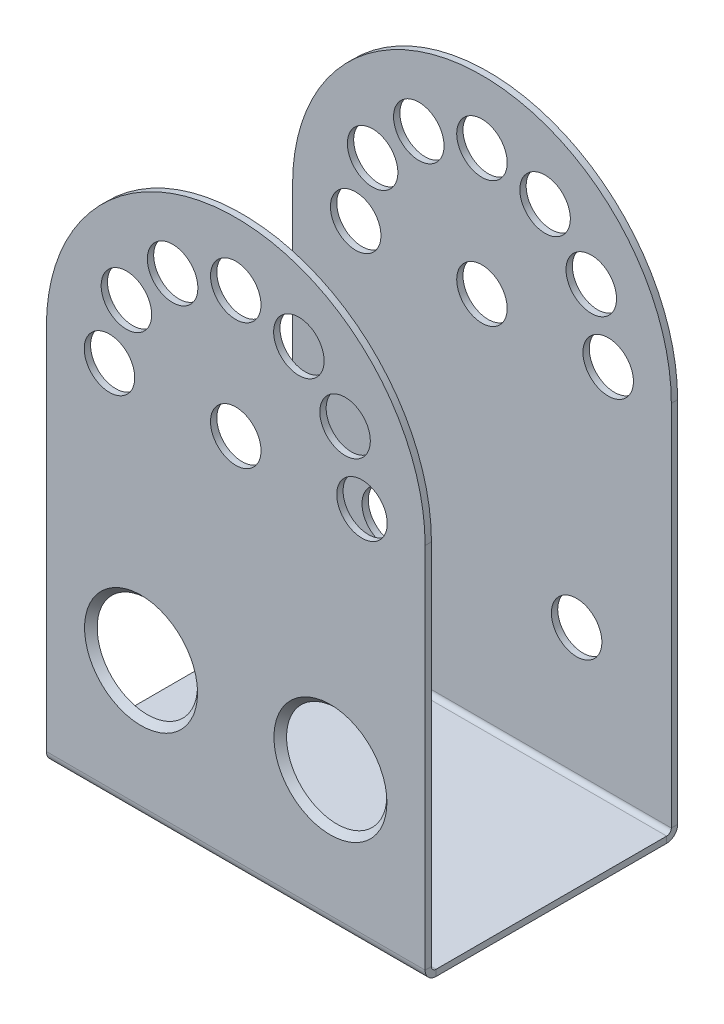
ISO-10303-21;
HEADER;
FILE_DESCRIPTION(('STEP AP214'),'2;1');
FILE_NAME('part.step','',(''),(''),'','','');
FILE_SCHEMA(('AUTOMOTIVE_DESIGN { 1 0 10303 214 1 1 1 1 }'));
ENDSEC;
DATA;
#1=APPLICATION_CONTEXT('core data for automotive mechanical design processes');
#2=APPLICATION_PROTOCOL_DEFINITION('international standard','automotive_design',2000,#1);
#3=PRODUCT_CONTEXT('',#1,'mechanical');
#4=PRODUCT('Part','Part','',(#3));
#5=PRODUCT_RELATED_PRODUCT_CATEGORY('part','',(#4));
#6=PRODUCT_DEFINITION_FORMATION('','',#4);
#7=PRODUCT_DEFINITION_CONTEXT('part definition',#1,'design');
#8=PRODUCT_DEFINITION('design','',#6,#7);
#9=PRODUCT_DEFINITION_SHAPE('','',#8);
#10=(LENGTH_UNIT() NAMED_UNIT(*) SI_UNIT(.MILLI.,.METRE.));
#11=(NAMED_UNIT(*) PLANE_ANGLE_UNIT() SI_UNIT($,.RADIAN.));
#12=(NAMED_UNIT(*) SI_UNIT($,.STERADIAN.) SOLID_ANGLE_UNIT());
#13=UNCERTAINTY_MEASURE_WITH_UNIT(LENGTH_MEASURE(1.E-05),#10,'distance_accuracy_value','');
#14=(GEOMETRIC_REPRESENTATION_CONTEXT(3) GLOBAL_UNCERTAINTY_ASSIGNED_CONTEXT((#13)) GLOBAL_UNIT_ASSIGNED_CONTEXT((#10,
#11,#12)) REPRESENTATION_CONTEXT('',''));
#15=CARTESIAN_POINT('',(0.,0.,0.));
#16=DIRECTION('',(0.,0.,1.));
#17=DIRECTION('',(1.,0.,0.));
#18=AXIS2_PLACEMENT_3D('',#15,#16,#17);
#19=CARTESIAN_POINT('',(0.,0.,20.));
#20=DIRECTION('',(0.,0.,1.));
#21=DIRECTION('',(0.,-1.,0.));
#22=AXIS2_PLACEMENT_3D('',#19,#20,#21);
#23=PLANE('',#22);
#24=CARTESIAN_POINT('',(-15.,20.7366,20.));
#25=DIRECTION('',(0.,0.,1.));
#26=DIRECTION('',(1.,0.,0.));
#27=AXIS2_PLACEMENT_3D('',#24,#25,#26);
#28=CIRCLE('',#27,8.95);
#29=CARTESIAN_POINT('',(-6.05,20.7366,20.));
#30=VERTEX_POINT('',#29);
#31=EDGE_CURVE('E1195',#30,#30,#28,.T.);
#32=ORIENTED_EDGE('',*,*,#31,.F.);
#33=EDGE_LOOP('',(#32));
#34=FACE_BOUND('',#33,.T.);
#35=CARTESIAN_POINT('',(15.,20.7366,20.));
#36=DIRECTION('',(0.,0.,1.));
#37=DIRECTION('',(1.,0.,0.));
#38=AXIS2_PLACEMENT_3D('',#35,#36,#37);
#39=CIRCLE('',#38,8.95);
#40=CARTESIAN_POINT('',(23.95,20.7366,20.));
#41=VERTEX_POINT('',#40);
#42=EDGE_CURVE('E1202',#41,#41,#39,.T.);
#43=ORIENTED_EDGE('',*,*,#42,.F.);
#44=EDGE_LOOP('',(#43));
#45=FACE_BOUND('',#44,.T.);
#46=CARTESIAN_POINT('',(0.,59.,20.));
#47=DIRECTION('',(0.,0.,1.));
#48=DIRECTION('',(1.,0.,0.));
#49=AXIS2_PLACEMENT_3D('',#46,#47,#48);
#50=CIRCLE('',#49,4.);
#51=CARTESIAN_POINT('',(4.,59.,20.));
#52=VERTEX_POINT('',#51);
#53=EDGE_CURVE('E474',#52,#52,#50,.T.);
#54=ORIENTED_EDGE('',*,*,#53,.F.);
#55=EDGE_LOOP('',(#54));
#56=FACE_BOUND('',#55,.T.);
#57=CARTESIAN_POINT('',(-17.3205080756888,69.,20.));
#58=DIRECTION('',(0.,0.,1.));
#59=DIRECTION('',(1.,0.,0.));
#60=AXIS2_PLACEMENT_3D('',#57,#58,#59);
#61=CIRCLE('',#60,4.00000000000001);
#62=CARTESIAN_POINT('',(-13.3205080756888,69.,20.));
#63=VERTEX_POINT('',#62);
#64=EDGE_CURVE('E511',#63,#63,#61,.T.);
#65=ORIENTED_EDGE('',*,*,#64,.F.);
#66=EDGE_LOOP('',(#65));
#67=FACE_BOUND('',#66,.T.);
#68=CARTESIAN_POINT('',(-9.99999999999996,76.3205080756888,20.));
#69=DIRECTION('',(0.,0.,1.));
#70=DIRECTION('',(1.,0.,0.));
#71=AXIS2_PLACEMENT_3D('',#68,#69,#70);
#72=CIRCLE('',#71,4.);
#73=CARTESIAN_POINT('',(-5.99999999999996,76.3205080756888,20.));
#74=VERTEX_POINT('',#73);
#75=EDGE_CURVE('E504',#74,#74,#72,.T.);
#76=ORIENTED_EDGE('',*,*,#75,.F.);
#77=EDGE_LOOP('',(#76));
#78=FACE_BOUND('',#77,.T.);
#79=CARTESIAN_POINT('',(-20.,59.,20.));
#80=DIRECTION('',(0.,0.,1.));
#81=DIRECTION('',(1.,0.,0.));
#82=AXIS2_PLACEMENT_3D('',#79,#80,#81);
#83=CIRCLE('',#82,4.);
#84=CARTESIAN_POINT('',(-16.,59.,20.));
#85=VERTEX_POINT('',#84);
#86=EDGE_CURVE('E350',#85,#85,#83,.T.);
#87=ORIENTED_EDGE('',*,*,#86,.F.);
#88=EDGE_LOOP('',(#87));
#89=FACE_BOUND('',#88,.T.);
#90=CARTESIAN_POINT('',(20.,59.,20.));
#91=DIRECTION('',(0.,0.,1.));
#92=DIRECTION('',(1.,0.,0.));
#93=AXIS2_PLACEMENT_3D('',#90,#91,#92);
#94=CIRCLE('',#93,4.);
#95=CARTESIAN_POINT('',(24.,59.,20.));
#96=VERTEX_POINT('',#95);
#97=EDGE_CURVE('E491',#96,#96,#94,.T.);
#98=ORIENTED_EDGE('',*,*,#97,.F.);
#99=EDGE_LOOP('',(#98));
#100=FACE_BOUND('',#99,.T.);
#101=CARTESIAN_POINT('',(17.3205080756888,68.9999999999999,20.));
#102=DIRECTION('',(0.,0.,1.));
#103=DIRECTION('',(1.,0.,0.));
#104=AXIS2_PLACEMENT_3D('',#101,#102,#103);
#105=CIRCLE('',#104,3.99999999999998);
#106=CARTESIAN_POINT('',(21.3205080756888,68.9999999999999,20.));
#107=VERTEX_POINT('',#106);
#108=EDGE_CURVE('E492',#107,#107,#105,.T.);
#109=ORIENTED_EDGE('',*,*,#108,.F.);
#110=EDGE_LOOP('',(#109));
#111=FACE_BOUND('',#110,.T.);
#112=CARTESIAN_POINT('',(10.0000000000001,76.3205080756887,20.));
#113=DIRECTION('',(0.,0.,1.));
#114=DIRECTION('',(1.,0.,0.));
#115=AXIS2_PLACEMENT_3D('',#112,#113,#114);
#116=CIRCLE('',#115,3.99999999999999);
#117=CARTESIAN_POINT('',(14.0000000000001,76.3205080756887,20.));
#118=VERTEX_POINT('',#117);
#119=EDGE_CURVE('E496',#118,#118,#116,.T.);
#120=ORIENTED_EDGE('',*,*,#119,.F.);
#121=EDGE_LOOP('',(#120));
#122=FACE_BOUND('',#121,.T.);
#123=CARTESIAN_POINT('',(0.,79.,20.));
#124=DIRECTION('',(0.,0.,1.));
#125=DIRECTION('',(1.,0.,0.));
#126=AXIS2_PLACEMENT_3D('',#123,#124,#125);
#127=CIRCLE('',#126,4.);
#128=CARTESIAN_POINT('',(4.,79.,20.));
#129=VERTEX_POINT('',#128);
#130=EDGE_CURVE('E500',#129,#129,#127,.T.);
#131=ORIENTED_EDGE('',*,*,#130,.F.);
#132=EDGE_LOOP('',(#131));
#133=FACE_BOUND('',#132,.T.);
#134=CARTESIAN_POINT('',(0.,59.,20.));
#135=DIRECTION('',(0.,0.,1.));
#136=DIRECTION('',(1.,0.,0.));
#137=AXIS2_PLACEMENT_3D('',#134,#135,#136);
#138=CIRCLE('',#137,30.);
#139=CARTESIAN_POINT('',(30.,59.,20.));
#140=VERTEX_POINT('',#139);
#141=CARTESIAN_POINT('',(-30.,59.,20.));
#142=VERTEX_POINT('',#141);
#143=EDGE_CURVE('E328',#140,#142,#138,.T.);
#144=ORIENTED_EDGE('',*,*,#143,.T.);
#145=DIRECTION('',(0.,1.,0.));
#146=VECTOR('',#145,1.);
#147=CARTESIAN_POINT('',(-30.,89.,20.0000000000003));
#148=LINE('',#147,#146);
#149=CARTESIAN_POINT('',(-30.,0.736599999999991,20.));
#150=VERTEX_POINT('',#149);
#151=EDGE_CURVE('E332',#150,#142,#148,.T.);
#152=ORIENTED_EDGE('',*,*,#151,.F.);
#153=DIRECTION('',(1.,0.,0.));
#154=VECTOR('',#153,1.);
#155=CARTESIAN_POINT('',(0.,0.736599999999997,20.));
#156=LINE('',#155,#154);
#157=CARTESIAN_POINT('',(30.,0.736599999999997,20.));
#158=VERTEX_POINT('',#157);
#159=EDGE_CURVE('E368',#150,#158,#156,.T.);
#160=ORIENTED_EDGE('',*,*,#159,.T.);
#161=DIRECTION('',(0.,-1.,0.));
#162=VECTOR('',#161,1.);
#163=CARTESIAN_POINT('',(30.,0.,20.));
#164=LINE('',#163,#162);
#165=EDGE_CURVE('E333',#140,#158,#164,.T.);
#166=ORIENTED_EDGE('',*,*,#165,.F.);
#167=EDGE_LOOP('',(#144,#152,#160,#166));
#168=FACE_BOUND('',#167,.T.);
#169=ADVANCED_FACE('F236',(#34,#45,#56,#67,#78,#89,#100,#111,#122,#133,#168),#23,.T.);
#170=CARTESIAN_POINT('',(0.,0.,19.));
#171=DIRECTION('',(0.,0.,1.));
#172=DIRECTION('',(0.,-1.,0.));
#173=AXIS2_PLACEMENT_3D('',#170,#171,#172);
#174=PLANE('',#173);
#175=CARTESIAN_POINT('',(-15.,20.7366,19.));
#176=DIRECTION('',(0.,0.,1.));
#177=DIRECTION('',(1.,0.,0.));
#178=AXIS2_PLACEMENT_3D('',#175,#176,#177);
#179=CIRCLE('',#178,7.94999999999999);
#180=CARTESIAN_POINT('',(-7.05,20.7366,19.));
#181=VERTEX_POINT('',#180);
#182=EDGE_CURVE('E482',#181,#181,#179,.T.);
#183=ORIENTED_EDGE('',*,*,#182,.T.);
#184=EDGE_LOOP('',(#183));
#185=FACE_BOUND('',#184,.T.);
#186=CARTESIAN_POINT('',(15.,20.7366,19.));
#187=DIRECTION('',(0.,0.,1.));
#188=DIRECTION('',(1.,0.,0.));
#189=AXIS2_PLACEMENT_3D('',#186,#187,#188);
#190=CIRCLE('',#189,7.94999999999999);
#191=CARTESIAN_POINT('',(22.95,20.7366,19.));
#192=VERTEX_POINT('',#191);
#193=EDGE_CURVE('E485',#192,#192,#190,.T.);
#194=ORIENTED_EDGE('',*,*,#193,.T.);
#195=EDGE_LOOP('',(#194));
#196=FACE_BOUND('',#195,.T.);
#197=CARTESIAN_POINT('',(0.,59.,19.0000000000002));
#198=DIRECTION('',(0.,0.,1.));
#199=DIRECTION('',(0.,-1.,0.));
#200=AXIS2_PLACEMENT_3D('',#197,#198,#199);
#201=CIRCLE('',#200,4.);
#202=CARTESIAN_POINT('',(0.,55.,19.0000000000002));
#203=VERTEX_POINT('',#202);
#204=EDGE_CURVE('E338',#203,#203,#201,.T.);
#205=ORIENTED_EDGE('',*,*,#204,.T.);
#206=EDGE_LOOP('',(#205));
#207=FACE_BOUND('',#206,.T.);
#208=CARTESIAN_POINT('',(-17.3205080756888,69.,19.0000000000002));
#209=DIRECTION('',(0.,0.,1.));
#210=DIRECTION('',(0.,-1.,0.));
#211=AXIS2_PLACEMENT_3D('',#208,#209,#210);
#212=CIRCLE('',#211,4.00000000000001);
#213=CARTESIAN_POINT('',(-17.3205080756888,65.,19.0000000000002));
#214=VERTEX_POINT('',#213);
#215=EDGE_CURVE('E464',#214,#214,#212,.T.);
#216=ORIENTED_EDGE('',*,*,#215,.T.);
#217=EDGE_LOOP('',(#216));
#218=FACE_BOUND('',#217,.T.);
#219=CARTESIAN_POINT('',(-9.99999999999996,76.3205080756888,19.0000000000003));
#220=DIRECTION('',(0.,0.,1.));
#221=DIRECTION('',(0.,-1.,0.));
#222=AXIS2_PLACEMENT_3D('',#219,#220,#221);
#223=CIRCLE('',#222,4.);
#224=CARTESIAN_POINT('',(-9.99999999999996,72.3205080756888,19.0000000000003));
#225=VERTEX_POINT('',#224);
#226=EDGE_CURVE('E459',#225,#225,#223,.T.);
#227=ORIENTED_EDGE('',*,*,#226,.T.);
#228=EDGE_LOOP('',(#227));
#229=FACE_BOUND('',#228,.T.);
#230=CARTESIAN_POINT('',(0.,79.,19.0000000000003));
#231=DIRECTION('',(0.,0.,1.));
#232=DIRECTION('',(0.,-1.,0.));
#233=AXIS2_PLACEMENT_3D('',#230,#231,#232);
#234=CIRCLE('',#233,4.);
#235=CARTESIAN_POINT('',(0.,75.,19.0000000000003));
#236=VERTEX_POINT('',#235);
#237=EDGE_CURVE('E429',#236,#236,#234,.T.);
#238=ORIENTED_EDGE('',*,*,#237,.T.);
#239=EDGE_LOOP('',(#238));
#240=FACE_BOUND('',#239,.T.);
#241=CARTESIAN_POINT('',(10.0000000000001,76.3205080756887,19.0000000000003));
#242=DIRECTION('',(0.,0.,1.));
#243=DIRECTION('',(0.,-1.,0.));
#244=AXIS2_PLACEMENT_3D('',#241,#242,#243);
#245=CIRCLE('',#244,3.99999999999999);
#246=CARTESIAN_POINT('',(10.0000000000001,72.3205080756887,19.0000000000003));
#247=VERTEX_POINT('',#246);
#248=EDGE_CURVE('E435',#247,#247,#245,.T.);
#249=ORIENTED_EDGE('',*,*,#248,.T.);
#250=EDGE_LOOP('',(#249));
#251=FACE_BOUND('',#250,.T.);
#252=CARTESIAN_POINT('',(17.3205080756888,68.9999999999999,19.0000000000002));
#253=DIRECTION('',(0.,0.,1.));
#254=DIRECTION('',(0.,-1.,0.));
#255=AXIS2_PLACEMENT_3D('',#252,#253,#254);
#256=CIRCLE('',#255,3.99999999999998);
#257=CARTESIAN_POINT('',(17.3205080756888,64.9999999999999,19.0000000000002));
#258=VERTEX_POINT('',#257);
#259=EDGE_CURVE('E441',#258,#258,#256,.T.);
#260=ORIENTED_EDGE('',*,*,#259,.T.);
#261=EDGE_LOOP('',(#260));
#262=FACE_BOUND('',#261,.T.);
#263=CARTESIAN_POINT('',(20.,59.,19.0000000000002));
#264=DIRECTION('',(0.,0.,1.));
#265=DIRECTION('',(0.,-1.,0.));
#266=AXIS2_PLACEMENT_3D('',#263,#264,#265);
#267=CIRCLE('',#266,4.);
#268=CARTESIAN_POINT('',(20.,55.,19.0000000000002));
#269=VERTEX_POINT('',#268);
#270=EDGE_CURVE('E447',#269,#269,#267,.T.);
#271=ORIENTED_EDGE('',*,*,#270,.T.);
#272=EDGE_LOOP('',(#271));
#273=FACE_BOUND('',#272,.T.);
#274=CARTESIAN_POINT('',(-20.,59.,19.0000000000002));
#275=DIRECTION('',(0.,0.,1.));
#276=DIRECTION('',(0.,-1.,0.));
#277=AXIS2_PLACEMENT_3D('',#274,#275,#276);
#278=CIRCLE('',#277,4.);
#279=CARTESIAN_POINT('',(-20.,55.,19.0000000000002));
#280=VERTEX_POINT('',#279);
#281=EDGE_CURVE('E453',#280,#280,#278,.T.);
#282=ORIENTED_EDGE('',*,*,#281,.T.);
#283=EDGE_LOOP('',(#282));
#284=FACE_BOUND('',#283,.T.);
#285=DIRECTION('',(0.,-1.,0.));
#286=VECTOR('',#285,1.);
#287=CARTESIAN_POINT('',(-30.,0.,19.));
#288=LINE('',#287,#286);
#289=CARTESIAN_POINT('',(-30.,0.736599999999994,19.));
#290=VERTEX_POINT('',#289);
#291=CARTESIAN_POINT('',(-30.,59.,19.0000000000002));
#292=VERTEX_POINT('',#291);
#293=EDGE_CURVE('E362',#290,#292,#288,.F.);
#294=ORIENTED_EDGE('',*,*,#293,.T.);
#295=CARTESIAN_POINT('',(0.,59.,19.0000000000002));
#296=DIRECTION('',(0.,0.,1.));
#297=DIRECTION('',(0.,-1.,0.));
#298=AXIS2_PLACEMENT_3D('',#295,#296,#297);
#299=CIRCLE('',#298,30.);
#300=CARTESIAN_POINT('',(30.,59.,19.0000000000003));
#301=VERTEX_POINT('',#300);
#302=EDGE_CURVE('E344',#301,#292,#299,.T.);
#303=ORIENTED_EDGE('',*,*,#302,.F.);
#304=DIRECTION('',(0.,1.,0.));
#305=VECTOR('',#304,1.);
#306=CARTESIAN_POINT('',(30.,0.,19.));
#307=LINE('',#306,#305);
#308=CARTESIAN_POINT('',(30.,0.736599999999994,19.));
#309=VERTEX_POINT('',#308);
#310=EDGE_CURVE('E356',#301,#309,#307,.F.);
#311=ORIENTED_EDGE('',*,*,#310,.T.);
#312=DIRECTION('',(-1.,0.,0.));
#313=VECTOR('',#312,1.);
#314=CARTESIAN_POINT('',(-30.,0.736599999999997,19.));
#315=LINE('',#314,#313);
#316=EDGE_CURVE('E375',#290,#309,#315,.F.);
#317=ORIENTED_EDGE('',*,*,#316,.F.);
#318=EDGE_LOOP('',(#294,#303,#311,#317));
#319=FACE_BOUND('',#318,.T.);
#320=ADVANCED_FACE('F681',(#185,#196,#207,#218,#229,#240,#251,#262,#273,#284,#319),#174,.F.);
#321=CARTESIAN_POINT('',(0.,0.,-20.));
#322=DIRECTION('',(0.,0.,-1.));
#323=DIRECTION('',(-1.,0.,0.));
#324=AXIS2_PLACEMENT_3D('',#321,#322,#323);
#325=PLANE('',#324);
#326=CARTESIAN_POINT('',(15.,20.7366,-20.));
#327=DIRECTION('',(0.,0.,-1.));
#328=DIRECTION('',(-1.,0.,0.));
#329=AXIS2_PLACEMENT_3D('',#326,#327,#328);
#330=CIRCLE('',#329,4.);
#331=CARTESIAN_POINT('',(11.,20.7366,-20.));
#332=VERTEX_POINT('',#331);
#333=EDGE_CURVE('E468',#332,#332,#330,.T.);
#334=ORIENTED_EDGE('',*,*,#333,.F.);
#335=EDGE_LOOP('',(#334));
#336=FACE_BOUND('',#335,.T.);
#337=CARTESIAN_POINT('',(-15.,20.7366,-20.));
#338=DIRECTION('',(0.,0.,-1.));
#339=DIRECTION('',(-1.,0.,0.));
#340=AXIS2_PLACEMENT_3D('',#337,#338,#339);
#341=CIRCLE('',#340,4.);
#342=CARTESIAN_POINT('',(-19.,20.7366,-20.));
#343=VERTEX_POINT('',#342);
#344=EDGE_CURVE('E476',#343,#343,#341,.T.);
#345=ORIENTED_EDGE('',*,*,#344,.F.);
#346=EDGE_LOOP('',(#345));
#347=FACE_BOUND('',#346,.T.);
#348=CARTESIAN_POINT('',(0.,59.,-20.));
#349=DIRECTION('',(0.,0.,-1.));
#350=DIRECTION('',(-1.,0.,0.));
#351=AXIS2_PLACEMENT_3D('',#348,#349,#350);
#352=CIRCLE('',#351,4.);
#353=CARTESIAN_POINT('',(-4.,59.,-20.));
#354=VERTEX_POINT('',#353);
#355=EDGE_CURVE('E463',#354,#354,#352,.T.);
#356=ORIENTED_EDGE('',*,*,#355,.F.);
#357=EDGE_LOOP('',(#356));
#358=FACE_BOUND('',#357,.T.);
#359=CARTESIAN_POINT('',(-17.3205080756888,69.,-20.));
#360=DIRECTION('',(0.,0.,-1.));
#361=DIRECTION('',(-1.,0.,0.));
#362=AXIS2_PLACEMENT_3D('',#359,#360,#361);
#363=CIRCLE('',#362,4.00000000000001);
#364=CARTESIAN_POINT('',(-21.3205080756888,69.,-20.));
#365=VERTEX_POINT('',#364);
#366=EDGE_CURVE('E458',#365,#365,#363,.T.);
#367=ORIENTED_EDGE('',*,*,#366,.F.);
#368=EDGE_LOOP('',(#367));
#369=FACE_BOUND('',#368,.T.);
#370=CARTESIAN_POINT('',(-9.99999999999996,76.3205080756888,-20.));
#371=DIRECTION('',(0.,0.,-1.));
#372=DIRECTION('',(-1.,0.,0.));
#373=AXIS2_PLACEMENT_3D('',#370,#371,#372);
#374=CIRCLE('',#373,4.);
#375=CARTESIAN_POINT('',(-14.,76.3205080756888,-20.));
#376=VERTEX_POINT('',#375);
#377=EDGE_CURVE('E452',#376,#376,#374,.T.);
#378=ORIENTED_EDGE('',*,*,#377,.F.);
#379=EDGE_LOOP('',(#378));
#380=FACE_BOUND('',#379,.T.);
#381=CARTESIAN_POINT('',(-20.,59.,-20.));
#382=DIRECTION('',(0.,0.,-1.));
#383=DIRECTION('',(-1.,0.,0.));
#384=AXIS2_PLACEMENT_3D('',#381,#382,#383);
#385=CIRCLE('',#384,4.);
#386=CARTESIAN_POINT('',(-24.,59.,-20.));
#387=VERTEX_POINT('',#386);
#388=EDGE_CURVE('E446',#387,#387,#385,.T.);
#389=ORIENTED_EDGE('',*,*,#388,.F.);
#390=EDGE_LOOP('',(#389));
#391=FACE_BOUND('',#390,.T.);
#392=CARTESIAN_POINT('',(20.,59.,-20.));
#393=DIRECTION('',(0.,0.,-1.));
#394=DIRECTION('',(-1.,0.,0.));
#395=AXIS2_PLACEMENT_3D('',#392,#393,#394);
#396=CIRCLE('',#395,4.);
#397=CARTESIAN_POINT('',(16.,59.,-20.));
#398=VERTEX_POINT('',#397);
#399=EDGE_CURVE('E440',#398,#398,#396,.T.);
#400=ORIENTED_EDGE('',*,*,#399,.F.);
#401=EDGE_LOOP('',(#400));
#402=FACE_BOUND('',#401,.T.);
#403=CARTESIAN_POINT('',(17.3205080756888,68.9999999999999,-20.));
#404=DIRECTION('',(0.,0.,-1.));
#405=DIRECTION('',(-1.,0.,0.));
#406=AXIS2_PLACEMENT_3D('',#403,#404,#405);
#407=CIRCLE('',#406,3.99999999999998);
#408=CARTESIAN_POINT('',(13.3205080756889,68.9999999999999,-20.));
#409=VERTEX_POINT('',#408);
#410=EDGE_CURVE('E434',#409,#409,#407,.T.);
#411=ORIENTED_EDGE('',*,*,#410,.F.);
#412=EDGE_LOOP('',(#411));
#413=FACE_BOUND('',#412,.T.);
#414=CARTESIAN_POINT('',(10.0000000000001,76.3205080756887,-20.));
#415=DIRECTION('',(0.,0.,-1.));
#416=DIRECTION('',(-1.,0.,0.));
#417=AXIS2_PLACEMENT_3D('',#414,#415,#416);
#418=CIRCLE('',#417,3.99999999999999);
#419=CARTESIAN_POINT('',(6.00000000000008,76.3205080756887,-20.));
#420=VERTEX_POINT('',#419);
#421=EDGE_CURVE('E428',#420,#420,#418,.T.);
#422=ORIENTED_EDGE('',*,*,#421,.F.);
#423=EDGE_LOOP('',(#422));
#424=FACE_BOUND('',#423,.T.);
#425=CARTESIAN_POINT('',(0.,79.,-20.));
#426=DIRECTION('',(0.,0.,-1.));
#427=DIRECTION('',(-1.,0.,0.));
#428=AXIS2_PLACEMENT_3D('',#425,#426,#427);
#429=CIRCLE('',#428,4.);
#430=CARTESIAN_POINT('',(-4.,79.,-20.));
#431=VERTEX_POINT('',#430);
#432=EDGE_CURVE('E423',#431,#431,#429,.T.);
#433=ORIENTED_EDGE('',*,*,#432,.F.);
#434=EDGE_LOOP('',(#433));
#435=FACE_BOUND('',#434,.T.);
#436=DIRECTION('',(0.,-1.,0.));
#437=VECTOR('',#436,1.);
#438=CARTESIAN_POINT('',(-30.,0.,-20.));
#439=LINE('',#438,#437);
#440=CARTESIAN_POINT('',(-30.,59.,-20.));
#441=VERTEX_POINT('',#440);
#442=CARTESIAN_POINT('',(-30.,0.736600000000004,-20.));
#443=VERTEX_POINT('',#442);
#444=EDGE_CURVE('E579',#441,#443,#439,.T.);
#445=ORIENTED_EDGE('',*,*,#444,.F.);
#446=CARTESIAN_POINT('',(0.,59.,-20.));
#447=DIRECTION('',(0.,0.,-1.));
#448=DIRECTION('',(-1.,0.,0.));
#449=AXIS2_PLACEMENT_3D('',#446,#447,#448);
#450=CIRCLE('',#449,30.);
#451=CARTESIAN_POINT('',(30.,59.,-20.));
#452=VERTEX_POINT('',#451);
#453=EDGE_CURVE('E572',#441,#452,#450,.T.);
#454=ORIENTED_EDGE('',*,*,#453,.T.);
#455=DIRECTION('',(0.,1.,0.));
#456=VECTOR('',#455,1.);
#457=CARTESIAN_POINT('',(30.,89.,-20.));
#458=LINE('',#457,#456);
#459=CARTESIAN_POINT('',(30.,0.736599999999992,-20.));
#460=VERTEX_POINT('',#459);
#461=EDGE_CURVE('E583',#460,#452,#458,.T.);
#462=ORIENTED_EDGE('',*,*,#461,.F.);
#463=DIRECTION('',(-1.,0.,0.));
#464=VECTOR('',#463,1.);
#465=CARTESIAN_POINT('',(0.,0.736600000000004,-20.));
#466=LINE('',#465,#464);
#467=EDGE_CURVE('E594',#460,#443,#466,.T.);
#468=ORIENTED_EDGE('',*,*,#467,.T.);
#469=EDGE_LOOP('',(#445,#454,#462,#468));
#470=FACE_BOUND('',#469,.T.);
#471=ADVANCED_FACE('F653',(#336,#347,#358,#369,#380,#391,#402,#413,#424,#435,#470),#325,.T.);
#472=CARTESIAN_POINT('',(0.,0.,-19.));
#473=DIRECTION('',(0.,0.,-1.));
#474=DIRECTION('',(-1.,0.,0.));
#475=AXIS2_PLACEMENT_3D('',#472,#473,#474);
#476=PLANE('',#475);
#477=CARTESIAN_POINT('',(15.,20.7366,-19.));
#478=DIRECTION('',(0.,0.,-1.));
#479=DIRECTION('',(-1.,0.,0.));
#480=AXIS2_PLACEMENT_3D('',#477,#478,#479);
#481=CIRCLE('',#480,4.);
#482=CARTESIAN_POINT('',(11.,20.7366,-19.));
#483=VERTEX_POINT('',#482);
#484=EDGE_CURVE('E240',#483,#483,#481,.T.);
#485=ORIENTED_EDGE('',*,*,#484,.T.);
#486=EDGE_LOOP('',(#485));
#487=FACE_BOUND('',#486,.T.);
#488=CARTESIAN_POINT('',(-15.,20.7366,-19.));
#489=DIRECTION('',(0.,0.,-1.));
#490=DIRECTION('',(-1.,0.,0.));
#491=AXIS2_PLACEMENT_3D('',#488,#489,#490);
#492=CIRCLE('',#491,4.);
#493=CARTESIAN_POINT('',(-19.,20.7366,-19.));
#494=VERTEX_POINT('',#493);
#495=EDGE_CURVE('E465',#494,#494,#492,.T.);
#496=ORIENTED_EDGE('',*,*,#495,.T.);
#497=EDGE_LOOP('',(#496));
#498=FACE_BOUND('',#497,.T.);
#499=CARTESIAN_POINT('',(0.,59.,-19.));
#500=DIRECTION('',(0.,0.,-1.));
#501=DIRECTION('',(-1.,0.,0.));
#502=AXIS2_PLACEMENT_3D('',#499,#500,#501);
#503=CIRCLE('',#502,4.);
#504=CARTESIAN_POINT('',(-4.,59.,-19.));
#505=VERTEX_POINT('',#504);
#506=EDGE_CURVE('E460',#505,#505,#503,.T.);
#507=ORIENTED_EDGE('',*,*,#506,.T.);
#508=EDGE_LOOP('',(#507));
#509=FACE_BOUND('',#508,.T.);
#510=CARTESIAN_POINT('',(-17.3205080756888,69.,-19.));
#511=DIRECTION('',(0.,0.,-1.));
#512=DIRECTION('',(-1.,0.,0.));
#513=AXIS2_PLACEMENT_3D('',#510,#511,#512);
#514=CIRCLE('',#513,4.00000000000001);
#515=CARTESIAN_POINT('',(-21.3205080756888,69.,-19.));
#516=VERTEX_POINT('',#515);
#517=EDGE_CURVE('E454',#516,#516,#514,.T.);
#518=ORIENTED_EDGE('',*,*,#517,.T.);
#519=EDGE_LOOP('',(#518));
#520=FACE_BOUND('',#519,.T.);
#521=CARTESIAN_POINT('',(-9.99999999999996,76.3205080756888,-19.));
#522=DIRECTION('',(0.,0.,-1.));
#523=DIRECTION('',(-1.,0.,0.));
#524=AXIS2_PLACEMENT_3D('',#521,#522,#523);
#525=CIRCLE('',#524,4.);
#526=CARTESIAN_POINT('',(-14.,76.3205080756888,-19.));
#527=VERTEX_POINT('',#526);
#528=EDGE_CURVE('E448',#527,#527,#525,.T.);
#529=ORIENTED_EDGE('',*,*,#528,.T.);
#530=EDGE_LOOP('',(#529));
#531=FACE_BOUND('',#530,.T.);
#532=CARTESIAN_POINT('',(0.,79.,-19.));
#533=DIRECTION('',(0.,0.,-1.));
#534=DIRECTION('',(-1.,0.,0.));
#535=AXIS2_PLACEMENT_3D('',#532,#533,#534);
#536=CIRCLE('',#535,4.);
#537=CARTESIAN_POINT('',(-4.,79.,-19.));
#538=VERTEX_POINT('',#537);
#539=EDGE_CURVE('E419',#538,#538,#536,.T.);
#540=ORIENTED_EDGE('',*,*,#539,.T.);
#541=EDGE_LOOP('',(#540));
#542=FACE_BOUND('',#541,.T.);
#543=CARTESIAN_POINT('',(10.0000000000001,76.3205080756887,-19.));
#544=DIRECTION('',(0.,0.,-1.));
#545=DIRECTION('',(-1.,0.,0.));
#546=AXIS2_PLACEMENT_3D('',#543,#544,#545);
#547=CIRCLE('',#546,3.99999999999999);
#548=CARTESIAN_POINT('',(6.00000000000008,76.3205080756887,-19.));
#549=VERTEX_POINT('',#548);
#550=EDGE_CURVE('E424',#549,#549,#547,.T.);
#551=ORIENTED_EDGE('',*,*,#550,.T.);
#552=EDGE_LOOP('',(#551));
#553=FACE_BOUND('',#552,.T.);
#554=CARTESIAN_POINT('',(17.3205080756888,68.9999999999999,-19.));
#555=DIRECTION('',(0.,0.,-1.));
#556=DIRECTION('',(-1.,0.,0.));
#557=AXIS2_PLACEMENT_3D('',#554,#555,#556);
#558=CIRCLE('',#557,3.99999999999998);
#559=CARTESIAN_POINT('',(13.3205080756889,68.9999999999999,-19.));
#560=VERTEX_POINT('',#559);
#561=EDGE_CURVE('E430',#560,#560,#558,.T.);
#562=ORIENTED_EDGE('',*,*,#561,.T.);
#563=EDGE_LOOP('',(#562));
#564=FACE_BOUND('',#563,.T.);
#565=CARTESIAN_POINT('',(20.,59.,-19.));
#566=DIRECTION('',(0.,0.,-1.));
#567=DIRECTION('',(-1.,0.,0.));
#568=AXIS2_PLACEMENT_3D('',#565,#566,#567);
#569=CIRCLE('',#568,4.);
#570=CARTESIAN_POINT('',(16.,59.,-19.));
#571=VERTEX_POINT('',#570);
#572=EDGE_CURVE('E436',#571,#571,#569,.T.);
#573=ORIENTED_EDGE('',*,*,#572,.T.);
#574=EDGE_LOOP('',(#573));
#575=FACE_BOUND('',#574,.T.);
#576=CARTESIAN_POINT('',(-20.,59.,-19.));
#577=DIRECTION('',(0.,0.,-1.));
#578=DIRECTION('',(-1.,0.,0.));
#579=AXIS2_PLACEMENT_3D('',#576,#577,#578);
#580=CIRCLE('',#579,4.);
#581=CARTESIAN_POINT('',(-24.,59.,-19.));
#582=VERTEX_POINT('',#581);
#583=EDGE_CURVE('E442',#582,#582,#580,.T.);
#584=ORIENTED_EDGE('',*,*,#583,.T.);
#585=EDGE_LOOP('',(#584));
#586=FACE_BOUND('',#585,.T.);
#587=CARTESIAN_POINT('',(0.,59.,-19.));
#588=DIRECTION('',(0.,0.,-1.));
#589=DIRECTION('',(-1.,0.,0.));
#590=AXIS2_PLACEMENT_3D('',#587,#588,#589);
#591=CIRCLE('',#590,30.);
#592=CARTESIAN_POINT('',(-30.,59.,-19.));
#593=VERTEX_POINT('',#592);
#594=CARTESIAN_POINT('',(30.,59.,-19.));
#595=VERTEX_POINT('',#594);
#596=EDGE_CURVE('E569',#593,#595,#591,.T.);
#597=ORIENTED_EDGE('',*,*,#596,.F.);
#598=DIRECTION('',(0.,1.,0.));
#599=VECTOR('',#598,1.);
#600=CARTESIAN_POINT('',(-30.,0.,-19.));
#601=LINE('',#600,#599);
#602=CARTESIAN_POINT('',(-30.,0.736599999999992,-19.));
#603=VERTEX_POINT('',#602);
#604=EDGE_CURVE('E587',#593,#603,#601,.F.);
#605=ORIENTED_EDGE('',*,*,#604,.T.);
#606=DIRECTION('',(1.,0.,0.));
#607=VECTOR('',#606,1.);
#608=CARTESIAN_POINT('',(30.,0.736599999999997,-19.));
#609=LINE('',#608,#607);
#610=CARTESIAN_POINT('',(30.,0.736599999999992,-19.));
#611=VERTEX_POINT('',#610);
#612=EDGE_CURVE('E602',#611,#603,#609,.F.);
#613=ORIENTED_EDGE('',*,*,#612,.F.);
#614=DIRECTION('',(0.,-1.,0.));
#615=VECTOR('',#614,1.);
#616=CARTESIAN_POINT('',(30.,0.,-19.));
#617=LINE('',#616,#615);
#618=EDGE_CURVE('E590',#611,#595,#617,.F.);
#619=ORIENTED_EDGE('',*,*,#618,.T.);
#620=EDGE_LOOP('',(#597,#605,#613,#619));
#621=FACE_BOUND('',#620,.T.);
#622=ADVANCED_FACE('F663',(#487,#498,#509,#520,#531,#542,#553,#564,#575,#586,#621),#476,.F.);
#623=CARTESIAN_POINT('',(30.,0.,20.));
#624=DIRECTION('',(1.,0.,0.));
#625=DIRECTION('',(0.,1.,0.));
#626=AXIS2_PLACEMENT_3D('',#623,#624,#625);
#627=PLANE('',#626);
#628=ORIENTED_EDGE('',*,*,#310,.F.);
#629=DIRECTION('',(0.,0.,1.));
#630=VECTOR('',#629,1.);
#631=CARTESIAN_POINT('',(30.,59.,-30.));
#632=LINE('',#631,#630);
#633=EDGE_CURVE('E337',#301,#140,#632,.T.);
#634=ORIENTED_EDGE('',*,*,#633,.T.);
#635=ORIENTED_EDGE('',*,*,#165,.T.);
#636=DIRECTION('',(0.,0.,1.));
#637=VECTOR('',#636,1.);
#638=CARTESIAN_POINT('',(30.,0.736599999999997,19.));
#639=LINE('',#638,#637);
#640=EDGE_CURVE('E371',#309,#158,#639,.T.);
#641=ORIENTED_EDGE('',*,*,#640,.F.);
#642=EDGE_LOOP('',(#628,#634,#635,#641));
#643=FACE_BOUND('',#642,.T.);
#644=ADVANCED_FACE('F684',(#643),#627,.T.);
#645=CARTESIAN_POINT('',(30.,89.,-20.));
#646=DIRECTION('',(1.,0.,0.));
#647=DIRECTION('',(0.,1.,0.));
#648=AXIS2_PLACEMENT_3D('',#645,#646,#647);
#649=PLANE('',#648);
#650=ORIENTED_EDGE('',*,*,#461,.T.);
#651=EDGE_CURVE('E568',#452,#595,#632,.T.);
#652=ORIENTED_EDGE('',*,*,#651,.T.);
#653=ORIENTED_EDGE('',*,*,#618,.F.);
#654=DIRECTION('',(0.,0.,-1.));
#655=VECTOR('',#654,1.);
#656=CARTESIAN_POINT('',(30.,0.736600000000018,-20.0000000000006));
#657=LINE('',#656,#655);
#658=EDGE_CURVE('E578',#611,#460,#657,.T.);
#659=ORIENTED_EDGE('',*,*,#658,.T.);
#660=EDGE_LOOP('',(#650,#652,#653,#659));
#661=FACE_BOUND('',#660,.T.);
#662=ADVANCED_FACE('F659',(#661),#649,.T.);
#663=CARTESIAN_POINT('',(0.,-1.,0.));
#664=DIRECTION('',(0.,1.,0.));
#665=DIRECTION('',(0.,0.,1.));
#666=AXIS2_PLACEMENT_3D('',#663,#664,#665);
#667=PLANE('',#666);
#668=DIRECTION('',(-1.,0.,0.));
#669=VECTOR('',#668,1.);
#670=CARTESIAN_POINT('',(-30.,-1.00000000000001,-18.2634));
#671=LINE('',#670,#669);
#672=CARTESIAN_POINT('',(-30.,-1.00000000000001,-18.2634));
#673=VERTEX_POINT('',#672);
#674=CARTESIAN_POINT('',(30.,-1.,-18.2634));
#675=VERTEX_POINT('',#674);
#676=EDGE_CURVE('E609',#673,#675,#671,.F.);
#677=ORIENTED_EDGE('',*,*,#676,.T.);
#678=DIRECTION('',(0.,0.,-1.));
#679=VECTOR('',#678,1.);
#680=CARTESIAN_POINT('',(30.,-1.,-20.));
#681=LINE('',#680,#679);
#682=CARTESIAN_POINT('',(30.,-1.,18.2634));
#683=VERTEX_POINT('',#682);
#684=EDGE_CURVE('E246',#683,#675,#681,.T.);
#685=ORIENTED_EDGE('',*,*,#684,.F.);
#686=DIRECTION('',(1.,0.,0.));
#687=VECTOR('',#686,1.);
#688=CARTESIAN_POINT('',(30.,-1.,18.2634));
#689=LINE('',#688,#687);
#690=CARTESIAN_POINT('',(-30.,-1.,18.2634));
#691=VERTEX_POINT('',#690);
#692=EDGE_CURVE('E382',#683,#691,#689,.F.);
#693=ORIENTED_EDGE('',*,*,#692,.T.);
#694=DIRECTION('',(0.,0.,1.));
#695=VECTOR('',#694,1.);
#696=CARTESIAN_POINT('',(-30.,-1.,-20.));
#697=LINE('',#696,#695);
#698=EDGE_CURVE('E13',#673,#691,#697,.T.);
#699=ORIENTED_EDGE('',*,*,#698,.F.);
#700=EDGE_LOOP('',(#677,#685,#693,#699));
#701=FACE_BOUND('',#700,.T.);
#702=ADVANCED_FACE('F1053',(#701),#667,.F.);
#703=CARTESIAN_POINT('',(0.,0.,0.));
#704=DIRECTION('',(0.,1.,0.));
#705=DIRECTION('',(0.,0.,1.));
#706=AXIS2_PLACEMENT_3D('',#703,#704,#705);
#707=PLANE('',#706);
#708=DIRECTION('',(0.,0.,-1.));
#709=VECTOR('',#708,1.);
#710=CARTESIAN_POINT('',(30.,0.,-20.));
#711=LINE('',#710,#709);
#712=CARTESIAN_POINT('',(30.,0.,18.2634));
#713=VERTEX_POINT('',#712);
#714=CARTESIAN_POINT('',(30.,0.,-18.2634));
#715=VERTEX_POINT('',#714);
#716=EDGE_CURVE('E407',#713,#715,#711,.T.);
#717=ORIENTED_EDGE('',*,*,#716,.T.);
#718=DIRECTION('',(-1.,0.,0.));
#719=VECTOR('',#718,1.);
#720=CARTESIAN_POINT('',(-30.,0.,-18.2634));
#721=LINE('',#720,#719);
#722=CARTESIAN_POINT('',(-30.,0.,-18.2634));
#723=VERTEX_POINT('',#722);
#724=EDGE_CURVE('E625',#723,#715,#721,.F.);
#725=ORIENTED_EDGE('',*,*,#724,.F.);
#726=DIRECTION('',(0.,0.,1.));
#727=VECTOR('',#726,1.);
#728=CARTESIAN_POINT('',(-30.,0.,-20.));
#729=LINE('',#728,#727);
#730=CARTESIAN_POINT('',(-30.,0.,18.2634));
#731=VERTEX_POINT('',#730);
#732=EDGE_CURVE('E413',#723,#731,#729,.T.);
#733=ORIENTED_EDGE('',*,*,#732,.T.);
#734=DIRECTION('',(1.,0.,0.));
#735=VECTOR('',#734,1.);
#736=CARTESIAN_POINT('',(30.,0.,18.2634));
#737=LINE('',#736,#735);
#738=EDGE_CURVE('E254',#713,#731,#737,.F.);
#739=ORIENTED_EDGE('',*,*,#738,.F.);
#740=EDGE_LOOP('',(#717,#725,#733,#739));
#741=FACE_BOUND('',#740,.T.);
#742=ADVANCED_FACE('F667',(#741),#707,.T.);
#743=CARTESIAN_POINT('',(-30.,-1.,-20.));
#744=DIRECTION('',(-1.,0.,0.));
#745=DIRECTION('',(0.,0.,1.));
#746=AXIS2_PLACEMENT_3D('',#743,#744,#745);
#747=PLANE('',#746);
#748=ORIENTED_EDGE('',*,*,#732,.F.);
#749=DIRECTION('',(0.,-1.,0.));
#750=VECTOR('',#749,1.);
#751=CARTESIAN_POINT('',(-30.,0.,-18.2634));
#752=LINE('',#751,#750);
#753=EDGE_CURVE('E617',#723,#673,#752,.T.);
#754=ORIENTED_EDGE('',*,*,#753,.T.);
#755=ORIENTED_EDGE('',*,*,#698,.T.);
#756=DIRECTION('',(0.,-1.,0.));
#757=VECTOR('',#756,1.);
#758=CARTESIAN_POINT('',(-30.,0.,18.2634));
#759=LINE('',#758,#757);
#760=EDGE_CURVE('E403',#731,#691,#759,.T.);
#761=ORIENTED_EDGE('',*,*,#760,.F.);
#762=EDGE_LOOP('',(#748,#754,#755,#761));
#763=FACE_BOUND('',#762,.T.);
#764=ADVANCED_FACE('F638',(#763),#747,.T.);
#765=CARTESIAN_POINT('',(30.,-1.,-20.));
#766=DIRECTION('',(1.,0.,0.));
#767=DIRECTION('',(0.,0.,-1.));
#768=AXIS2_PLACEMENT_3D('',#765,#766,#767);
#769=PLANE('',#768);
#770=DIRECTION('',(0.,-1.,0.));
#771=VECTOR('',#770,1.);
#772=CARTESIAN_POINT('',(30.,0.,-18.2634));
#773=LINE('',#772,#771);
#774=EDGE_CURVE('E381',#715,#675,#773,.T.);
#775=ORIENTED_EDGE('',*,*,#774,.F.);
#776=ORIENTED_EDGE('',*,*,#716,.F.);
#777=DIRECTION('',(0.,-1.,0.));
#778=VECTOR('',#777,1.);
#779=CARTESIAN_POINT('',(30.,0.,18.2634));
#780=LINE('',#779,#778);
#781=EDGE_CURVE('E390',#713,#683,#780,.T.);
#782=ORIENTED_EDGE('',*,*,#781,.T.);
#783=ORIENTED_EDGE('',*,*,#684,.T.);
#784=EDGE_LOOP('',(#775,#776,#782,#783));
#785=FACE_BOUND('',#784,.T.);
#786=ADVANCED_FACE('F238',(#785),#769,.T.);
#787=CARTESIAN_POINT('',(-30.,0.736599999999997,18.2634));
#788=DIRECTION('',(-1.,0.,0.));
#789=DIRECTION('',(0.,0.,1.));
#790=AXIS2_PLACEMENT_3D('',#787,#788,#789);
#791=PLANE('',#790);
#792=DIRECTION('',(0.,0.,1.));
#793=VECTOR('',#792,1.);
#794=CARTESIAN_POINT('',(-30.,0.736600000000004,20.0000000000003));
#795=LINE('',#794,#793);
#796=EDGE_CURVE('E354',#290,#150,#795,.T.);
#797=ORIENTED_EDGE('',*,*,#796,.F.);
#798=CARTESIAN_POINT('',(-30.,0.736599999999997,18.2634));
#799=DIRECTION('',(1.,0.,0.));
#800=DIRECTION('',(0.,0.,-1.));
#801=AXIS2_PLACEMENT_3D('',#798,#799,#800);
#802=CIRCLE('',#801,0.7366);
#803=EDGE_CURVE('E394',#731,#290,#802,.F.);
#804=ORIENTED_EDGE('',*,*,#803,.F.);
#805=ORIENTED_EDGE('',*,*,#760,.T.);
#806=CARTESIAN_POINT('',(-30.,0.736599999999997,18.2634));
#807=DIRECTION('',(1.,0.,0.));
#808=DIRECTION('',(0.,0.,-1.));
#809=AXIS2_PLACEMENT_3D('',#806,#807,#808);
#810=CIRCLE('',#809,1.7366);
#811=EDGE_CURVE('E385',#691,#150,#810,.F.);
#812=ORIENTED_EDGE('',*,*,#811,.T.);
#813=EDGE_LOOP('',(#797,#804,#805,#812));
#814=FACE_BOUND('',#813,.T.);
#815=ADVANCED_FACE('F689',(#814),#791,.T.);
#816=CARTESIAN_POINT('',(30.,0.736599999999997,18.2634));
#817=DIRECTION('',(-1.,0.,0.));
#818=DIRECTION('',(0.,0.,1.));
#819=AXIS2_PLACEMENT_3D('',#816,#817,#818);
#820=PLANE('',#819);
#821=CARTESIAN_POINT('',(30.,0.736599999999997,18.2634));
#822=DIRECTION('',(1.,0.,0.));
#823=DIRECTION('',(0.,0.,-1.));
#824=AXIS2_PLACEMENT_3D('',#821,#822,#823);
#825=CIRCLE('',#824,0.7366);
#826=EDGE_CURVE('E360',#309,#713,#825,.T.);
#827=ORIENTED_EDGE('',*,*,#826,.F.);
#828=ORIENTED_EDGE('',*,*,#640,.T.);
#829=CARTESIAN_POINT('',(30.,0.736599999999997,18.2634));
#830=DIRECTION('',(1.,0.,0.));
#831=DIRECTION('',(0.,0.,-1.));
#832=AXIS2_PLACEMENT_3D('',#829,#830,#831);
#833=CIRCLE('',#832,1.7366);
#834=EDGE_CURVE('E386',#158,#683,#833,.T.);
#835=ORIENTED_EDGE('',*,*,#834,.T.);
#836=ORIENTED_EDGE('',*,*,#781,.F.);
#837=EDGE_LOOP('',(#827,#828,#835,#836));
#838=FACE_BOUND('',#837,.T.);
#839=ADVANCED_FACE('F673',(#838),#820,.F.);
#840=CARTESIAN_POINT('',(30.,0.736599999999997,18.2634));
#841=DIRECTION('',(1.,0.,0.));
#842=DIRECTION('',(0.,0.,1.));
#843=AXIS2_PLACEMENT_3D('',#840,#841,#842);
#844=CYLINDRICAL_SURFACE('',#843,1.7366);
#845=ORIENTED_EDGE('',*,*,#692,.F.);
#846=ORIENTED_EDGE('',*,*,#834,.F.);
#847=ORIENTED_EDGE('',*,*,#159,.F.);
#848=ORIENTED_EDGE('',*,*,#811,.F.);
#849=EDGE_LOOP('',(#845,#846,#847,#848));
#850=FACE_BOUND('',#849,.T.);
#851=ADVANCED_FACE('F687',(#850),#844,.T.);
#852=CARTESIAN_POINT('',(30.,0.736599999999997,18.2634));
#853=DIRECTION('',(1.,0.,0.));
#854=DIRECTION('',(0.,0.,1.));
#855=AXIS2_PLACEMENT_3D('',#852,#853,#854);
#856=CYLINDRICAL_SURFACE('',#855,0.7366);
#857=ORIENTED_EDGE('',*,*,#738,.T.);
#858=ORIENTED_EDGE('',*,*,#803,.T.);
#859=ORIENTED_EDGE('',*,*,#316,.T.);
#860=ORIENTED_EDGE('',*,*,#826,.T.);
#861=EDGE_LOOP('',(#857,#858,#859,#860));
#862=FACE_BOUND('',#861,.T.);
#863=ADVANCED_FACE('F677',(#862),#856,.F.);
#864=CARTESIAN_POINT('',(-30.,89.,20.0000000000003));
#865=DIRECTION('',(-1.,0.,0.));
#866=DIRECTION('',(0.,-1.,0.));
#867=AXIS2_PLACEMENT_3D('',#864,#865,#866);
#868=PLANE('',#867);
#869=DIRECTION('',(0.,0.,1.));
#870=VECTOR('',#869,1.);
#871=CARTESIAN_POINT('',(-30.,59.,-30.));
#872=LINE('',#871,#870);
#873=EDGE_CURVE('E341',#292,#142,#872,.T.);
#874=ORIENTED_EDGE('',*,*,#873,.F.);
#875=ORIENTED_EDGE('',*,*,#293,.F.);
#876=ORIENTED_EDGE('',*,*,#796,.T.);
#877=ORIENTED_EDGE('',*,*,#151,.T.);
#878=EDGE_LOOP('',(#874,#875,#876,#877));
#879=FACE_BOUND('',#878,.T.);
#880=ADVANCED_FACE('F353',(#879),#868,.T.);
#881=CARTESIAN_POINT('',(30.,0.736599999999992,-18.2634));
#882=DIRECTION('',(1.,0.,0.));
#883=DIRECTION('',(0.,0.,-1.));
#884=AXIS2_PLACEMENT_3D('',#881,#882,#883);
#885=PLANE('',#884);
#886=ORIENTED_EDGE('',*,*,#658,.F.);
#887=CARTESIAN_POINT('',(30.,0.736599999999992,-18.2634));
#888=DIRECTION('',(-1.,0.,0.));
#889=DIRECTION('',(0.,0.,1.));
#890=AXIS2_PLACEMENT_3D('',#887,#888,#889);
#891=CIRCLE('',#890,0.7366);
#892=EDGE_CURVE('E621',#715,#611,#891,.F.);
#893=ORIENTED_EDGE('',*,*,#892,.F.);
#894=ORIENTED_EDGE('',*,*,#774,.T.);
#895=CARTESIAN_POINT('',(30.,0.736599999999992,-18.2634));
#896=DIRECTION('',(-1.,0.,0.));
#897=DIRECTION('',(0.,0.,1.));
#898=AXIS2_PLACEMENT_3D('',#895,#896,#897);
#899=CIRCLE('',#898,1.7366);
#900=EDGE_CURVE('E612',#675,#460,#899,.F.);
#901=ORIENTED_EDGE('',*,*,#900,.T.);
#902=EDGE_LOOP('',(#886,#893,#894,#901));
#903=FACE_BOUND('',#902,.T.);
#904=ADVANCED_FACE('F655',(#903),#885,.T.);
#905=CARTESIAN_POINT('',(-30.,0.736599999999992,-18.2634));
#906=DIRECTION('',(1.,0.,0.));
#907=DIRECTION('',(0.,0.,-1.));
#908=AXIS2_PLACEMENT_3D('',#905,#906,#907);
#909=PLANE('',#908);
#910=CARTESIAN_POINT('',(-30.,0.736599999999992,-18.2634));
#911=DIRECTION('',(-1.,0.,0.));
#912=DIRECTION('',(0.,0.,1.));
#913=AXIS2_PLACEMENT_3D('',#910,#911,#912);
#914=CIRCLE('',#913,0.7366);
#915=EDGE_CURVE('E582',#603,#723,#914,.T.);
#916=ORIENTED_EDGE('',*,*,#915,.F.);
#917=DIRECTION('',(0.,0.,-1.));
#918=VECTOR('',#917,1.);
#919=CARTESIAN_POINT('',(-30.,0.736599999999997,-19.));
#920=LINE('',#919,#918);
#921=EDGE_CURVE('E598',#603,#443,#920,.T.);
#922=ORIENTED_EDGE('',*,*,#921,.T.);
#923=CARTESIAN_POINT('',(-30.,0.736599999999992,-18.2634));
#924=DIRECTION('',(-1.,0.,0.));
#925=DIRECTION('',(0.,0.,1.));
#926=AXIS2_PLACEMENT_3D('',#923,#924,#925);
#927=CIRCLE('',#926,1.7366);
#928=EDGE_CURVE('E613',#443,#673,#927,.T.);
#929=ORIENTED_EDGE('',*,*,#928,.T.);
#930=ORIENTED_EDGE('',*,*,#753,.F.);
#931=EDGE_LOOP('',(#916,#922,#929,#930));
#932=FACE_BOUND('',#931,.T.);
#933=ADVANCED_FACE('F646',(#932),#909,.F.);
#934=CARTESIAN_POINT('',(-30.,0.736599999999992,-18.2634));
#935=DIRECTION('',(-1.,0.,0.));
#936=DIRECTION('',(0.,0.,-1.));
#937=AXIS2_PLACEMENT_3D('',#934,#935,#936);
#938=CYLINDRICAL_SURFACE('',#937,1.7366);
#939=ORIENTED_EDGE('',*,*,#676,.F.);
#940=ORIENTED_EDGE('',*,*,#928,.F.);
#941=ORIENTED_EDGE('',*,*,#467,.F.);
#942=ORIENTED_EDGE('',*,*,#900,.F.);
#943=EDGE_LOOP('',(#939,#940,#941,#942));
#944=FACE_BOUND('',#943,.T.);
#945=ADVANCED_FACE('F644',(#944),#938,.T.);
#946=CARTESIAN_POINT('',(-30.,0.736599999999992,-18.2634));
#947=DIRECTION('',(-1.,0.,0.));
#948=DIRECTION('',(0.,0.,-1.));
#949=AXIS2_PLACEMENT_3D('',#946,#947,#948);
#950=CYLINDRICAL_SURFACE('',#949,0.7366);
#951=ORIENTED_EDGE('',*,*,#724,.T.);
#952=ORIENTED_EDGE('',*,*,#892,.T.);
#953=ORIENTED_EDGE('',*,*,#612,.T.);
#954=ORIENTED_EDGE('',*,*,#915,.T.);
#955=EDGE_LOOP('',(#951,#952,#953,#954));
#956=FACE_BOUND('',#955,.T.);
#957=ADVANCED_FACE('F666',(#956),#950,.F.);
#958=CARTESIAN_POINT('',(-30.,0.,-20.));
#959=DIRECTION('',(-1.,0.,0.));
#960=DIRECTION('',(0.,-1.,0.));
#961=AXIS2_PLACEMENT_3D('',#958,#959,#960);
#962=PLANE('',#961);
#963=EDGE_CURVE('E349',#441,#593,#872,.T.);
#964=ORIENTED_EDGE('',*,*,#963,.F.);
#965=ORIENTED_EDGE('',*,*,#444,.T.);
#966=ORIENTED_EDGE('',*,*,#921,.F.);
#967=ORIENTED_EDGE('',*,*,#604,.F.);
#968=EDGE_LOOP('',(#964,#965,#966,#967));
#969=FACE_BOUND('',#968,.T.);
#970=ADVANCED_FACE('F751',(#969),#962,.T.);
#971=CARTESIAN_POINT('',(0.,59.,-30.));
#972=DIRECTION('',(0.,0.,1.));
#973=DIRECTION('',(1.,0.,0.));
#974=AXIS2_PLACEMENT_3D('',#971,#972,#973);
#975=CYLINDRICAL_SURFACE('',#974,30.);
#976=ORIENTED_EDGE('',*,*,#453,.F.);
#977=ORIENTED_EDGE('',*,*,#963,.T.);
#978=ORIENTED_EDGE('',*,*,#596,.T.);
#979=ORIENTED_EDGE('',*,*,#651,.F.);
#980=EDGE_LOOP('',(#976,#977,#978,#979));
#981=FACE_BOUND('',#980,.T.);
#982=ADVANCED_FACE('F758',(#981),#975,.T.);
#983=ORIENTED_EDGE('',*,*,#302,.T.);
#984=ORIENTED_EDGE('',*,*,#873,.T.);
#985=ORIENTED_EDGE('',*,*,#143,.F.);
#986=ORIENTED_EDGE('',*,*,#633,.F.);
#987=EDGE_LOOP('',(#983,#984,#985,#986));
#988=FACE_BOUND('',#987,.T.);
#989=ADVANCED_FACE('F342',(#988),#975,.T.);
#990=CARTESIAN_POINT('',(0.,79.,-30.));
#991=DIRECTION('',(0.,0.,1.));
#992=DIRECTION('',(1.,0.,0.));
#993=AXIS2_PLACEMENT_3D('',#990,#991,#992);
#994=CYLINDRICAL_SURFACE('',#993,4.);
#995=ORIENTED_EDGE('',*,*,#432,.T.);
#996=EDGE_LOOP('',(#995));
#997=FACE_BOUND('',#996,.T.);
#998=ORIENTED_EDGE('',*,*,#539,.F.);
#999=EDGE_LOOP('',(#998));
#1000=FACE_BOUND('',#999,.T.);
#1001=ADVANCED_FACE('F772',(#997,#1000),#994,.F.);
#1002=CARTESIAN_POINT('',(10.0000000000001,76.3205080756887,-30.));
#1003=DIRECTION('',(0.,0.,1.));
#1004=DIRECTION('',(1.,0.,0.));
#1005=AXIS2_PLACEMENT_3D('',#1002,#1003,#1004);
#1006=CYLINDRICAL_SURFACE('',#1005,3.99999999999999);
#1007=ORIENTED_EDGE('',*,*,#421,.T.);
#1008=EDGE_LOOP('',(#1007));
#1009=FACE_BOUND('',#1008,.T.);
#1010=ORIENTED_EDGE('',*,*,#550,.F.);
#1011=EDGE_LOOP('',(#1010));
#1012=FACE_BOUND('',#1011,.T.);
#1013=ADVANCED_FACE('F778',(#1009,#1012),#1006,.F.);
#1014=CARTESIAN_POINT('',(17.3205080756888,68.9999999999999,-30.));
#1015=DIRECTION('',(0.,0.,1.));
#1016=DIRECTION('',(1.,0.,0.));
#1017=AXIS2_PLACEMENT_3D('',#1014,#1015,#1016);
#1018=CYLINDRICAL_SURFACE('',#1017,3.99999999999998);
#1019=ORIENTED_EDGE('',*,*,#410,.T.);
#1020=EDGE_LOOP('',(#1019));
#1021=FACE_BOUND('',#1020,.T.);
#1022=ORIENTED_EDGE('',*,*,#561,.F.);
#1023=EDGE_LOOP('',(#1022));
#1024=FACE_BOUND('',#1023,.T.);
#1025=ADVANCED_FACE('F787',(#1021,#1024),#1018,.F.);
#1026=CARTESIAN_POINT('',(20.,59.,-30.));
#1027=DIRECTION('',(0.,0.,1.));
#1028=DIRECTION('',(1.,0.,0.));
#1029=AXIS2_PLACEMENT_3D('',#1026,#1027,#1028);
#1030=CYLINDRICAL_SURFACE('',#1029,4.);
#1031=ORIENTED_EDGE('',*,*,#399,.T.);
#1032=EDGE_LOOP('',(#1031));
#1033=FACE_BOUND('',#1032,.T.);
#1034=ORIENTED_EDGE('',*,*,#572,.F.);
#1035=EDGE_LOOP('',(#1034));
#1036=FACE_BOUND('',#1035,.T.);
#1037=ADVANCED_FACE('F796',(#1033,#1036),#1030,.F.);
#1038=CARTESIAN_POINT('',(-20.,59.,-30.));
#1039=DIRECTION('',(0.,0.,1.));
#1040=DIRECTION('',(1.,0.,0.));
#1041=AXIS2_PLACEMENT_3D('',#1038,#1039,#1040);
#1042=CYLINDRICAL_SURFACE('',#1041,4.);
#1043=ORIENTED_EDGE('',*,*,#388,.T.);
#1044=EDGE_LOOP('',(#1043));
#1045=FACE_BOUND('',#1044,.T.);
#1046=ORIENTED_EDGE('',*,*,#583,.F.);
#1047=EDGE_LOOP('',(#1046));
#1048=FACE_BOUND('',#1047,.T.);
#1049=ADVANCED_FACE('F805',(#1045,#1048),#1042,.F.);
#1050=CARTESIAN_POINT('',(-9.99999999999996,76.3205080756888,-30.));
#1051=DIRECTION('',(0.,0.,1.));
#1052=DIRECTION('',(1.,0.,0.));
#1053=AXIS2_PLACEMENT_3D('',#1050,#1051,#1052);
#1054=CYLINDRICAL_SURFACE('',#1053,4.);
#1055=ORIENTED_EDGE('',*,*,#377,.T.);
#1056=EDGE_LOOP('',(#1055));
#1057=FACE_BOUND('',#1056,.T.);
#1058=ORIENTED_EDGE('',*,*,#528,.F.);
#1059=EDGE_LOOP('',(#1058));
#1060=FACE_BOUND('',#1059,.T.);
#1061=ADVANCED_FACE('F814',(#1057,#1060),#1054,.F.);
#1062=CARTESIAN_POINT('',(-17.3205080756888,69.,-30.));
#1063=DIRECTION('',(0.,0.,1.));
#1064=DIRECTION('',(1.,0.,0.));
#1065=AXIS2_PLACEMENT_3D('',#1062,#1063,#1064);
#1066=CYLINDRICAL_SURFACE('',#1065,4.00000000000001);
#1067=ORIENTED_EDGE('',*,*,#366,.T.);
#1068=EDGE_LOOP('',(#1067));
#1069=FACE_BOUND('',#1068,.T.);
#1070=ORIENTED_EDGE('',*,*,#517,.F.);
#1071=EDGE_LOOP('',(#1070));
#1072=FACE_BOUND('',#1071,.T.);
#1073=ADVANCED_FACE('F823',(#1069,#1072),#1066,.F.);
#1074=CARTESIAN_POINT('',(0.,59.,-30.));
#1075=DIRECTION('',(0.,0.,1.));
#1076=DIRECTION('',(1.,0.,0.));
#1077=AXIS2_PLACEMENT_3D('',#1074,#1075,#1076);
#1078=CYLINDRICAL_SURFACE('',#1077,4.);
#1079=ORIENTED_EDGE('',*,*,#355,.T.);
#1080=EDGE_LOOP('',(#1079));
#1081=FACE_BOUND('',#1080,.T.);
#1082=ORIENTED_EDGE('',*,*,#506,.F.);
#1083=EDGE_LOOP('',(#1082));
#1084=FACE_BOUND('',#1083,.T.);
#1085=ADVANCED_FACE('F832',(#1081,#1084),#1078,.F.);
#1086=ORIENTED_EDGE('',*,*,#130,.T.);
#1087=EDGE_LOOP('',(#1086));
#1088=FACE_BOUND('',#1087,.T.);
#1089=ORIENTED_EDGE('',*,*,#237,.F.);
#1090=EDGE_LOOP('',(#1089));
#1091=FACE_BOUND('',#1090,.T.);
#1092=ADVANCED_FACE('F781',(#1088,#1091),#994,.F.);
#1093=ORIENTED_EDGE('',*,*,#119,.T.);
#1094=EDGE_LOOP('',(#1093));
#1095=FACE_BOUND('',#1094,.T.);
#1096=ORIENTED_EDGE('',*,*,#248,.F.);
#1097=EDGE_LOOP('',(#1096));
#1098=FACE_BOUND('',#1097,.T.);
#1099=ADVANCED_FACE('F790',(#1095,#1098),#1006,.F.);
#1100=ORIENTED_EDGE('',*,*,#108,.T.);
#1101=EDGE_LOOP('',(#1100));
#1102=FACE_BOUND('',#1101,.T.);
#1103=ORIENTED_EDGE('',*,*,#259,.F.);
#1104=EDGE_LOOP('',(#1103));
#1105=FACE_BOUND('',#1104,.T.);
#1106=ADVANCED_FACE('F799',(#1102,#1105),#1018,.F.);
#1107=ORIENTED_EDGE('',*,*,#97,.T.);
#1108=EDGE_LOOP('',(#1107));
#1109=FACE_BOUND('',#1108,.T.);
#1110=ORIENTED_EDGE('',*,*,#270,.F.);
#1111=EDGE_LOOP('',(#1110));
#1112=FACE_BOUND('',#1111,.T.);
#1113=ADVANCED_FACE('F808',(#1109,#1112),#1030,.F.);
#1114=ORIENTED_EDGE('',*,*,#86,.T.);
#1115=EDGE_LOOP('',(#1114));
#1116=FACE_BOUND('',#1115,.T.);
#1117=ORIENTED_EDGE('',*,*,#281,.F.);
#1118=EDGE_LOOP('',(#1117));
#1119=FACE_BOUND('',#1118,.T.);
#1120=ADVANCED_FACE('F817',(#1116,#1119),#1042,.F.);
#1121=ORIENTED_EDGE('',*,*,#75,.T.);
#1122=EDGE_LOOP('',(#1121));
#1123=FACE_BOUND('',#1122,.T.);
#1124=ORIENTED_EDGE('',*,*,#226,.F.);
#1125=EDGE_LOOP('',(#1124));
#1126=FACE_BOUND('',#1125,.T.);
#1127=ADVANCED_FACE('F826',(#1123,#1126),#1054,.F.);
#1128=ORIENTED_EDGE('',*,*,#64,.T.);
#1129=EDGE_LOOP('',(#1128));
#1130=FACE_BOUND('',#1129,.T.);
#1131=ORIENTED_EDGE('',*,*,#215,.F.);
#1132=EDGE_LOOP('',(#1131));
#1133=FACE_BOUND('',#1132,.T.);
#1134=ADVANCED_FACE('F835',(#1130,#1133),#1066,.F.);
#1135=ORIENTED_EDGE('',*,*,#53,.T.);
#1136=EDGE_LOOP('',(#1135));
#1137=FACE_BOUND('',#1136,.T.);
#1138=ORIENTED_EDGE('',*,*,#204,.F.);
#1139=EDGE_LOOP('',(#1138));
#1140=FACE_BOUND('',#1139,.T.);
#1141=ADVANCED_FACE('F843',(#1137,#1140),#1078,.F.);
#1142=CARTESIAN_POINT('',(-15.,20.7366,-10.));
#1143=DIRECTION('',(0.,0.,-1.));
#1144=DIRECTION('',(-1.,0.,0.));
#1145=AXIS2_PLACEMENT_3D('',#1142,#1143,#1144);
#1146=CYLINDRICAL_SURFACE('',#1145,4.);
#1147=ORIENTED_EDGE('',*,*,#344,.T.);
#1148=EDGE_LOOP('',(#1147));
#1149=FACE_BOUND('',#1148,.T.);
#1150=ORIENTED_EDGE('',*,*,#495,.F.);
#1151=EDGE_LOOP('',(#1150));
#1152=FACE_BOUND('',#1151,.T.);
#1153=ADVANCED_FACE('F891',(#1149,#1152),#1146,.F.);
#1154=CARTESIAN_POINT('',(15.,20.7366,-10.));
#1155=DIRECTION('',(0.,0.,-1.));
#1156=DIRECTION('',(-1.,0.,0.));
#1157=AXIS2_PLACEMENT_3D('',#1154,#1155,#1156);
#1158=CYLINDRICAL_SURFACE('',#1157,4.);
#1159=ORIENTED_EDGE('',*,*,#333,.T.);
#1160=EDGE_LOOP('',(#1159));
#1161=FACE_BOUND('',#1160,.T.);
#1162=ORIENTED_EDGE('',*,*,#484,.F.);
#1163=EDGE_LOOP('',(#1162));
#1164=FACE_BOUND('',#1163,.T.);
#1165=ADVANCED_FACE('F899',(#1161,#1164),#1158,.F.);
#1166=CARTESIAN_POINT('',(15.,20.7366,20.));
#1167=DIRECTION('',(0.,0.,1.));
#1168=DIRECTION('',(1.,0.,0.));
#1169=AXIS2_PLACEMENT_3D('',#1166,#1167,#1168);
#1170=CONICAL_SURFACE('',#1169,8.95,0.78539816339745);
#1171=ORIENTED_EDGE('',*,*,#193,.F.);
#1172=EDGE_LOOP('',(#1171));
#1173=FACE_BOUND('',#1172,.T.);
#1174=ORIENTED_EDGE('',*,*,#42,.T.);
#1175=EDGE_LOOP('',(#1174));
#1176=FACE_BOUND('',#1175,.T.);
#1177=ADVANCED_FACE('F908',(#1173,#1176),#1170,.F.);
#1178=CARTESIAN_POINT('',(-15.,20.7366,20.));
#1179=DIRECTION('',(0.,0.,1.));
#1180=DIRECTION('',(1.,0.,0.));
#1181=AXIS2_PLACEMENT_3D('',#1178,#1179,#1180);
#1182=CONICAL_SURFACE('',#1181,8.95,0.78539816339745);
#1183=ORIENTED_EDGE('',*,*,#182,.F.);
#1184=EDGE_LOOP('',(#1183));
#1185=FACE_BOUND('',#1184,.T.);
#1186=ORIENTED_EDGE('',*,*,#31,.T.);
#1187=EDGE_LOOP('',(#1186));
#1188=FACE_BOUND('',#1187,.T.);
#1189=ADVANCED_FACE('F915',(#1185,#1188),#1182,.F.);
#1190=CLOSED_SHELL('',(#169,#320,#471,#622,#644,#662,#702,#742,#764,#786,#815,#839,#851,#863,
#880,#904,#933,#945,#957,#970,#982,#989,#1001,#1013,#1025,#1037,#1049,#1061,#1073,#1085,#1092,
#1099,#1106,#1113,#1120,#1127,#1134,#1141,#1153,#1165,#1177,#1189));
#1191=MANIFOLD_SOLID_BREP('B2',#1190);
#1192=ADVANCED_BREP_SHAPE_REPRESENTATION('',(#18,#1191),#14);
#1193=SHAPE_DEFINITION_REPRESENTATION(#9,#1192);
ENDSEC;
END-ISO-10303-21;
